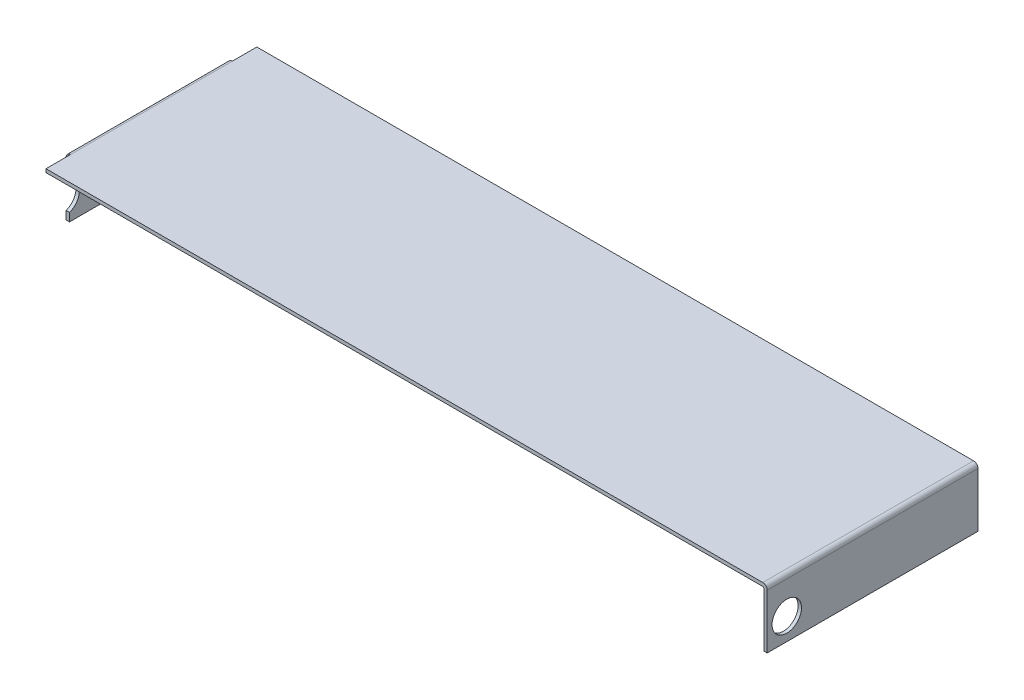
ISO-10303-21;
HEADER;
FILE_DESCRIPTION(('STEP AP214'),'2;1');
FILE_NAME('part.step','',(''),(''),'','','');
FILE_SCHEMA(('AUTOMOTIVE_DESIGN { 1 0 10303 214 1 1 1 1 }'));
ENDSEC;
DATA;
#1=APPLICATION_CONTEXT('core data for automotive mechanical design processes');
#2=APPLICATION_PROTOCOL_DEFINITION('international standard','automotive_design',2000,#1);
#3=PRODUCT_CONTEXT('',#1,'mechanical');
#4=PRODUCT('Part','Part','',(#3));
#5=PRODUCT_RELATED_PRODUCT_CATEGORY('part','',(#4));
#6=PRODUCT_DEFINITION_FORMATION('','',#4);
#7=PRODUCT_DEFINITION_CONTEXT('part definition',#1,'design');
#8=PRODUCT_DEFINITION('design','',#6,#7);
#9=PRODUCT_DEFINITION_SHAPE('','',#8);
#10=(LENGTH_UNIT() NAMED_UNIT(*) SI_UNIT(.MILLI.,.METRE.));
#11=(NAMED_UNIT(*) PLANE_ANGLE_UNIT() SI_UNIT($,.RADIAN.));
#12=(NAMED_UNIT(*) SI_UNIT($,.STERADIAN.) SOLID_ANGLE_UNIT());
#13=UNCERTAINTY_MEASURE_WITH_UNIT(LENGTH_MEASURE(1.E-05),#10,'distance_accuracy_value','');
#14=(GEOMETRIC_REPRESENTATION_CONTEXT(3) GLOBAL_UNCERTAINTY_ASSIGNED_CONTEXT((#13)) GLOBAL_UNIT_ASSIGNED_CONTEXT((#10,
#11,#12)) REPRESENTATION_CONTEXT('',''));
#15=CARTESIAN_POINT('',(0.,0.,0.));
#16=DIRECTION('',(0.,0.,1.));
#17=DIRECTION('',(1.,0.,0.));
#18=AXIS2_PLACEMENT_3D('',#15,#16,#17);
#19=CARTESIAN_POINT('',(-73.1,-12.01,16.));
#20=DIRECTION('',(0.,0.,-1.));
#21=DIRECTION('',(-1.,0.,0.));
#22=AXIS2_PLACEMENT_3D('',#19,#20,#21);
#23=PLANE('',#22);
#24=DIRECTION('',(0.,1.,0.));
#25=VECTOR('',#24,1.);
#26=CARTESIAN_POINT('',(-73.3,2.72643264896885E-13,16.));
#27=LINE('',#26,#25);
#28=CARTESIAN_POINT('',(-73.3,-12.,16.));
#29=VERTEX_POINT('',#28);
#30=CARTESIAN_POINT('',(-73.3,-10.3284271247457,16.));
#31=VERTEX_POINT('',#30);
#32=EDGE_CURVE('E157',#29,#31,#27,.T.);
#33=ORIENTED_EDGE('',*,*,#32,.T.);
#34=DIRECTION('',(-1.,0.,0.));
#35=VECTOR('',#34,1.);
#36=CARTESIAN_POINT('',(-64.,-10.3284271247457,16.));
#37=LINE('',#36,#35);
#38=CARTESIAN_POINT('',(-74.,-10.3284271247457,16.));
#39=VERTEX_POINT('',#38);
#40=EDGE_CURVE('E52',#39,#31,#37,.F.);
#41=ORIENTED_EDGE('',*,*,#40,.F.);
#42=DIRECTION('',(0.,1.,0.));
#43=VECTOR('',#42,1.);
#44=CARTESIAN_POINT('',(-74.,2.75087301834076E-13,16.));
#45=LINE('',#44,#43);
#46=CARTESIAN_POINT('',(-74.,-12.,16.));
#47=VERTEX_POINT('',#46);
#48=EDGE_CURVE('E316',#47,#39,#45,.T.);
#49=ORIENTED_EDGE('',*,*,#48,.F.);
#50=DIRECTION('',(-1.,0.,0.));
#51=VECTOR('',#50,1.);
#52=CARTESIAN_POINT('',(-73.9999999999999,-12.,16.));
#53=LINE('',#52,#51);
#54=EDGE_CURVE('E172',#29,#47,#53,.T.);
#55=ORIENTED_EDGE('',*,*,#54,.F.);
#56=EDGE_LOOP('',(#33,#41,#49,#55));
#57=FACE_BOUND('',#56,.T.);
#58=ADVANCED_FACE('F35',(#57),#23,.F.);
#59=CARTESIAN_POINT('',(-73.1,-12.01,21.));
#60=DIRECTION('',(0.,0.,-1.));
#61=DIRECTION('',(-1.,0.,0.));
#62=AXIS2_PLACEMENT_3D('',#59,#60,#61);
#63=PLANE('',#62);
#64=CARTESIAN_POINT('',(73.1,-0.900000000000012,21.));
#65=DIRECTION('',(0.,0.,-1.));
#66=DIRECTION('',(-1.,0.,0.));
#67=AXIS2_PLACEMENT_3D('',#64,#65,#66);
#68=CIRCLE('',#67,0.899999999999992);
#69=CARTESIAN_POINT('',(74.,-0.90000000000001,21.));
#70=VERTEX_POINT('',#69);
#71=CARTESIAN_POINT('',(73.1,0.,21.));
#72=VERTEX_POINT('',#71);
#73=EDGE_CURVE('E245',#70,#72,#68,.F.);
#74=ORIENTED_EDGE('',*,*,#73,.T.);
#75=DIRECTION('',(-1.,0.,0.));
#76=VECTOR('',#75,1.);
#77=CARTESIAN_POINT('',(0.,0.,21.));
#78=LINE('',#77,#76);
#79=CARTESIAN_POINT('',(-73.1,0.,21.));
#80=VERTEX_POINT('',#79);
#81=EDGE_CURVE('E243',#72,#80,#78,.T.);
#82=ORIENTED_EDGE('',*,*,#81,.T.);
#83=DIRECTION('',(0.,1.,0.));
#84=VECTOR('',#83,1.);
#85=CARTESIAN_POINT('',(-73.1,-12.01,21.));
#86=LINE('',#85,#84);
#87=CARTESIAN_POINT('',(-73.1,-0.700000000000007,21.));
#88=VERTEX_POINT('',#87);
#89=EDGE_CURVE('E186',#88,#80,#86,.T.);
#90=ORIENTED_EDGE('',*,*,#89,.F.);
#91=DIRECTION('',(-1.,0.,0.));
#92=VECTOR('',#91,1.);
#93=CARTESIAN_POINT('',(0.,-0.7,21.));
#94=LINE('',#93,#92);
#95=CARTESIAN_POINT('',(73.1,-0.700000000000021,21.));
#96=VERTEX_POINT('',#95);
#97=EDGE_CURVE('E242',#96,#88,#94,.T.);
#98=ORIENTED_EDGE('',*,*,#97,.F.);
#99=CARTESIAN_POINT('',(73.1,-0.900000000000012,21.));
#100=DIRECTION('',(0.,0.,-1.));
#101=DIRECTION('',(-1.,0.,0.));
#102=AXIS2_PLACEMENT_3D('',#99,#100,#101);
#103=CIRCLE('',#102,0.199999999999992);
#104=CARTESIAN_POINT('',(73.3,-0.900000000000012,21.));
#105=VERTEX_POINT('',#104);
#106=EDGE_CURVE('E306',#105,#96,#103,.F.);
#107=ORIENTED_EDGE('',*,*,#106,.F.);
#108=DIRECTION('',(0.,-1.,0.));
#109=VECTOR('',#108,1.);
#110=CARTESIAN_POINT('',(73.3,1.81762176597924E-13,21.));
#111=LINE('',#110,#109);
#112=CARTESIAN_POINT('',(73.3,-12.,21.));
#113=VERTEX_POINT('',#112);
#114=EDGE_CURVE('E254',#105,#113,#111,.T.);
#115=ORIENTED_EDGE('',*,*,#114,.T.);
#116=DIRECTION('',(-1.,0.,0.));
#117=VECTOR('',#116,1.);
#118=CARTESIAN_POINT('',(74.,-12.,21.));
#119=LINE('',#118,#117);
#120=CARTESIAN_POINT('',(74.,-12.,21.));
#121=VERTEX_POINT('',#120);
#122=EDGE_CURVE('E297',#121,#113,#119,.T.);
#123=ORIENTED_EDGE('',*,*,#122,.F.);
#124=DIRECTION('',(0.,-1.,0.));
#125=VECTOR('',#124,1.);
#126=CARTESIAN_POINT('',(74.,1.84206213535114E-13,21.));
#127=LINE('',#126,#125);
#128=EDGE_CURVE('E302',#70,#121,#127,.T.);
#129=ORIENTED_EDGE('',*,*,#128,.F.);
#130=EDGE_LOOP('',(#74,#82,#90,#98,#107,#115,#123,#129));
#131=FACE_BOUND('',#130,.T.);
#132=ADVANCED_FACE('F334',(#131),#63,.F.);
#133=CARTESIAN_POINT('',(-73.1,-12.01,21.));
#134=DIRECTION('',(1.,0.,0.));
#135=DIRECTION('',(0.,0.,-1.));
#136=AXIS2_PLACEMENT_3D('',#133,#134,#135);
#137=PLANE('',#136);
#138=ORIENTED_EDGE('',*,*,#89,.T.);
#139=DIRECTION('',(0.,0.,-1.));
#140=VECTOR('',#139,1.);
#141=CARTESIAN_POINT('',(-73.1,0.,-45.));
#142=LINE('',#141,#140);
#143=CARTESIAN_POINT('',(-73.1,0.,16.));
#144=VERTEX_POINT('',#143);
#145=EDGE_CURVE('E216',#144,#80,#142,.F.);
#146=ORIENTED_EDGE('',*,*,#145,.F.);
#147=DIRECTION('',(0.,1.,0.));
#148=VECTOR('',#147,1.);
#149=CARTESIAN_POINT('',(-73.1,-12.01,16.));
#150=LINE('',#149,#148);
#151=CARTESIAN_POINT('',(-73.1,-0.700000000000007,16.));
#152=VERTEX_POINT('',#151);
#153=EDGE_CURVE('E39',#152,#144,#150,.T.);
#154=ORIENTED_EDGE('',*,*,#153,.F.);
#155=DIRECTION('',(0.,0.,-1.));
#156=VECTOR('',#155,1.);
#157=CARTESIAN_POINT('',(-73.1,-0.700000000000007,-45.));
#158=LINE('',#157,#156);
#159=EDGE_CURVE('E182',#152,#88,#158,.F.);
#160=ORIENTED_EDGE('',*,*,#159,.T.);
#161=EDGE_LOOP('',(#138,#146,#154,#160));
#162=FACE_BOUND('',#161,.T.);
#163=ADVANCED_FACE('F332',(#162),#137,.F.);
#164=CARTESIAN_POINT('',(-73.1,-0.900000000000013,16.));
#165=DIRECTION('',(0.,0.,-1.));
#166=DIRECTION('',(-1.,0.,0.));
#167=AXIS2_PLACEMENT_3D('',#164,#165,#166);
#168=CIRCLE('',#167,0.900000000000006);
#169=CARTESIAN_POINT('',(-74.,-0.900000000000009,16.));
#170=VERTEX_POINT('',#169);
#171=EDGE_CURVE('E199',#144,#170,#168,.F.);
#172=ORIENTED_EDGE('',*,*,#171,.T.);
#173=CARTESIAN_POINT('',(-74.,-4.67157287525326,16.));
#174=VERTEX_POINT('',#173);
#175=EDGE_CURVE('E173',#174,#170,#45,.T.);
#176=ORIENTED_EDGE('',*,*,#175,.F.);
#177=DIRECTION('',(-1.,0.,0.));
#178=VECTOR('',#177,1.);
#179=CARTESIAN_POINT('',(-64.,-4.6715728752533,16.));
#180=LINE('',#179,#178);
#181=CARTESIAN_POINT('',(-73.3,-4.67157287525326,16.));
#182=VERTEX_POINT('',#181);
#183=EDGE_CURVE('E238',#182,#174,#180,.T.);
#184=ORIENTED_EDGE('',*,*,#183,.F.);
#185=CARTESIAN_POINT('',(-73.3,-0.900000000000012,16.));
#186=VERTEX_POINT('',#185);
#187=EDGE_CURVE('E60',#182,#186,#27,.T.);
#188=ORIENTED_EDGE('',*,*,#187,.T.);
#189=CARTESIAN_POINT('',(-73.1,-0.900000000000013,16.));
#190=DIRECTION('',(0.,0.,-1.));
#191=DIRECTION('',(-1.,0.,0.));
#192=AXIS2_PLACEMENT_3D('',#189,#190,#191);
#193=CIRCLE('',#192,0.200000000000006);
#194=EDGE_CURVE('E201',#152,#186,#193,.F.);
#195=ORIENTED_EDGE('',*,*,#194,.F.);
#196=ORIENTED_EDGE('',*,*,#153,.T.);
#197=EDGE_LOOP('',(#172,#176,#184,#188,#195,#196));
#198=FACE_BOUND('',#197,.T.);
#199=ADVANCED_FACE('F197',(#198),#23,.F.);
#200=CARTESIAN_POINT('',(-73.1,-12.01,-17.));
#201=DIRECTION('',(0.,0.,-1.));
#202=DIRECTION('',(-1.,0.,0.));
#203=AXIS2_PLACEMENT_3D('',#200,#201,#202);
#204=PLANE('',#203);
#205=CARTESIAN_POINT('',(-73.1,-0.900000000000013,-17.));
#206=DIRECTION('',(0.,0.,-1.));
#207=DIRECTION('',(-1.,0.,0.));
#208=AXIS2_PLACEMENT_3D('',#205,#206,#207);
#209=CIRCLE('',#208,0.900000000000006);
#210=CARTESIAN_POINT('',(-73.1,0.,-17.));
#211=VERTEX_POINT('',#210);
#212=CARTESIAN_POINT('',(-74.,-0.900000000000009,-17.));
#213=VERTEX_POINT('',#212);
#214=EDGE_CURVE('E304',#211,#213,#209,.F.);
#215=ORIENTED_EDGE('',*,*,#214,.F.);
#216=DIRECTION('',(0.,1.,0.));
#217=VECTOR('',#216,1.);
#218=CARTESIAN_POINT('',(-73.1,-12.01,-17.));
#219=LINE('',#218,#217);
#220=CARTESIAN_POINT('',(-73.1,-0.700000000000007,-17.));
#221=VERTEX_POINT('',#220);
#222=EDGE_CURVE('E11',#221,#211,#219,.T.);
#223=ORIENTED_EDGE('',*,*,#222,.F.);
#224=CARTESIAN_POINT('',(-73.1,-0.900000000000013,-17.));
#225=DIRECTION('',(0.,0.,-1.));
#226=DIRECTION('',(-1.,0.,0.));
#227=AXIS2_PLACEMENT_3D('',#224,#225,#226);
#228=CIRCLE('',#227,0.200000000000006);
#229=CARTESIAN_POINT('',(-73.3,-0.900000000000012,-17.));
#230=VERTEX_POINT('',#229);
#231=EDGE_CURVE('E170',#221,#230,#228,.F.);
#232=ORIENTED_EDGE('',*,*,#231,.T.);
#233=DIRECTION('',(0.,1.,0.));
#234=VECTOR('',#233,1.);
#235=CARTESIAN_POINT('',(-73.3,2.72643264896886E-13,-17.));
#236=LINE('',#235,#234);
#237=CARTESIAN_POINT('',(-73.3,-12.,-17.));
#238=VERTEX_POINT('',#237);
#239=EDGE_CURVE('E155',#238,#230,#236,.T.);
#240=ORIENTED_EDGE('',*,*,#239,.F.);
#241=DIRECTION('',(-1.,0.,0.));
#242=VECTOR('',#241,1.);
#243=CARTESIAN_POINT('',(-74.,-12.,-17.));
#244=LINE('',#243,#242);
#245=CARTESIAN_POINT('',(-74.,-12.,-17.));
#246=VERTEX_POINT('',#245);
#247=EDGE_CURVE('E168',#238,#246,#244,.T.);
#248=ORIENTED_EDGE('',*,*,#247,.T.);
#249=DIRECTION('',(0.,1.,0.));
#250=VECTOR('',#249,1.);
#251=CARTESIAN_POINT('',(-74.,2.75087301834076E-13,-17.));
#252=LINE('',#251,#250);
#253=EDGE_CURVE('E259',#246,#213,#252,.T.);
#254=ORIENTED_EDGE('',*,*,#253,.T.);
#255=EDGE_LOOP('',(#215,#223,#232,#240,#248,#254));
#256=FACE_BOUND('',#255,.T.);
#257=ADVANCED_FACE('F166',(#256),#204,.T.);
#258=CARTESIAN_POINT('',(-73.1,-12.01,-22.));
#259=DIRECTION('',(-1.,0.,0.));
#260=DIRECTION('',(0.,0.,1.));
#261=AXIS2_PLACEMENT_3D('',#258,#259,#260);
#262=PLANE('',#261);
#263=DIRECTION('',(0.,1.,0.));
#264=VECTOR('',#263,1.);
#265=CARTESIAN_POINT('',(-73.1,-12.01,-22.));
#266=LINE('',#265,#264);
#267=CARTESIAN_POINT('',(-73.1,-0.700000000000007,-22.));
#268=VERTEX_POINT('',#267);
#269=CARTESIAN_POINT('',(-73.1,0.,-22.));
#270=VERTEX_POINT('',#269);
#271=EDGE_CURVE('E44',#268,#270,#266,.T.);
#272=ORIENTED_EDGE('',*,*,#271,.F.);
#273=EDGE_CURVE('E178',#268,#221,#158,.F.);
#274=ORIENTED_EDGE('',*,*,#273,.T.);
#275=ORIENTED_EDGE('',*,*,#222,.T.);
#276=EDGE_CURVE('E219',#270,#211,#142,.F.);
#277=ORIENTED_EDGE('',*,*,#276,.F.);
#278=EDGE_LOOP('',(#272,#274,#275,#277));
#279=FACE_BOUND('',#278,.T.);
#280=ADVANCED_FACE('F341',(#279),#262,.T.);
#281=CARTESIAN_POINT('',(-73.1,-12.01,-22.));
#282=DIRECTION('',(0.,0.,-1.));
#283=DIRECTION('',(-1.,0.,0.));
#284=AXIS2_PLACEMENT_3D('',#281,#282,#283);
#285=PLANE('',#284);
#286=CARTESIAN_POINT('',(73.1,-0.900000000000012,-22.));
#287=DIRECTION('',(0.,0.,-1.));
#288=DIRECTION('',(-1.,0.,0.));
#289=AXIS2_PLACEMENT_3D('',#286,#287,#288);
#290=CIRCLE('',#289,0.899999999999992);
#291=CARTESIAN_POINT('',(74.,-0.90000000000001,-22.));
#292=VERTEX_POINT('',#291);
#293=CARTESIAN_POINT('',(73.1,0.,-22.));
#294=VERTEX_POINT('',#293);
#295=EDGE_CURVE('E292',#292,#294,#290,.F.);
#296=ORIENTED_EDGE('',*,*,#295,.F.);
#297=DIRECTION('',(0.,-1.,0.));
#298=VECTOR('',#297,1.);
#299=CARTESIAN_POINT('',(74.,1.84206213535114E-13,-22.));
#300=LINE('',#299,#298);
#301=CARTESIAN_POINT('',(74.,-12.,-22.));
#302=VERTEX_POINT('',#301);
#303=EDGE_CURVE('E251',#292,#302,#300,.T.);
#304=ORIENTED_EDGE('',*,*,#303,.T.);
#305=DIRECTION('',(-1.,0.,0.));
#306=VECTOR('',#305,1.);
#307=CARTESIAN_POINT('',(74.,-12.,-22.));
#308=LINE('',#307,#306);
#309=CARTESIAN_POINT('',(73.3,-12.,-22.));
#310=VERTEX_POINT('',#309);
#311=EDGE_CURVE('E209',#302,#310,#308,.T.);
#312=ORIENTED_EDGE('',*,*,#311,.T.);
#313=DIRECTION('',(0.,-1.,0.));
#314=VECTOR('',#313,1.);
#315=CARTESIAN_POINT('',(73.3,1.81762176597924E-13,-22.));
#316=LINE('',#315,#314);
#317=CARTESIAN_POINT('',(73.3,-0.900000000000012,-22.));
#318=VERTEX_POINT('',#317);
#319=EDGE_CURVE('E300',#318,#310,#316,.T.);
#320=ORIENTED_EDGE('',*,*,#319,.F.);
#321=CARTESIAN_POINT('',(73.1,-0.900000000000012,-22.));
#322=DIRECTION('',(0.,0.,-1.));
#323=DIRECTION('',(-1.,0.,0.));
#324=AXIS2_PLACEMENT_3D('',#321,#322,#323);
#325=CIRCLE('',#324,0.199999999999992);
#326=CARTESIAN_POINT('',(73.1,-0.700000000000021,-22.));
#327=VERTEX_POINT('',#326);
#328=EDGE_CURVE('E248',#318,#327,#325,.F.);
#329=ORIENTED_EDGE('',*,*,#328,.T.);
#330=DIRECTION('',(-1.,0.,0.));
#331=VECTOR('',#330,1.);
#332=CARTESIAN_POINT('',(0.,-0.7,-22.));
#333=LINE('',#332,#331);
#334=EDGE_CURVE('E239',#327,#268,#333,.T.);
#335=ORIENTED_EDGE('',*,*,#334,.T.);
#336=ORIENTED_EDGE('',*,*,#271,.T.);
#337=DIRECTION('',(-1.,0.,0.));
#338=VECTOR('',#337,1.);
#339=CARTESIAN_POINT('',(0.,0.,-22.));
#340=LINE('',#339,#338);
#341=EDGE_CURVE('E311',#294,#270,#340,.T.);
#342=ORIENTED_EDGE('',*,*,#341,.F.);
#343=EDGE_LOOP('',(#296,#304,#312,#320,#329,#335,#336,#342));
#344=FACE_BOUND('',#343,.T.);
#345=ADVANCED_FACE('F290',(#344),#285,.T.);
#346=CARTESIAN_POINT('',(73.1,-0.900000000000012,45.));
#347=DIRECTION('',(0.,0.,1.));
#348=DIRECTION('',(1.,0.,0.));
#349=AXIS2_PLACEMENT_3D('',#346,#347,#348);
#350=CYLINDRICAL_SURFACE('',#349,0.899999999999992);
#351=DIRECTION('',(0.,0.,1.));
#352=VECTOR('',#351,1.);
#353=CARTESIAN_POINT('',(74.,-0.90000000000001,-45.));
#354=LINE('',#353,#352);
#355=EDGE_CURVE('E226',#70,#292,#354,.F.);
#356=ORIENTED_EDGE('',*,*,#355,.T.);
#357=ORIENTED_EDGE('',*,*,#295,.T.);
#358=DIRECTION('',(0.,0.,1.));
#359=VECTOR('',#358,1.);
#360=CARTESIAN_POINT('',(73.1,0.,45.));
#361=LINE('',#360,#359);
#362=EDGE_CURVE('E236',#72,#294,#361,.F.);
#363=ORIENTED_EDGE('',*,*,#362,.F.);
#364=ORIENTED_EDGE('',*,*,#73,.F.);
#365=EDGE_LOOP('',(#356,#357,#363,#364));
#366=FACE_BOUND('',#365,.T.);
#367=ADVANCED_FACE('F339',(#366),#350,.T.);
#368=CARTESIAN_POINT('',(0.,0.,0.));
#369=DIRECTION('',(0.,1.,0.));
#370=DIRECTION('',(0.,0.,1.));
#371=AXIS2_PLACEMENT_3D('',#368,#369,#370);
#372=PLANE('',#371);
#373=ORIENTED_EDGE('',*,*,#362,.T.);
#374=ORIENTED_EDGE('',*,*,#341,.T.);
#375=ORIENTED_EDGE('',*,*,#276,.T.);
#376=EDGE_CURVE('E208',#211,#144,#142,.F.);
#377=ORIENTED_EDGE('',*,*,#376,.T.);
#378=ORIENTED_EDGE('',*,*,#145,.T.);
#379=ORIENTED_EDGE('',*,*,#81,.F.);
#380=EDGE_LOOP('',(#373,#374,#375,#377,#378,#379));
#381=FACE_BOUND('',#380,.T.);
#382=ADVANCED_FACE('F215',(#381),#372,.T.);
#383=CARTESIAN_POINT('',(73.1,-0.900000000000012,45.));
#384=DIRECTION('',(0.,0.,1.));
#385=DIRECTION('',(1.,0.,0.));
#386=AXIS2_PLACEMENT_3D('',#383,#384,#385);
#387=CYLINDRICAL_SURFACE('',#386,0.199999999999992);
#388=ORIENTED_EDGE('',*,*,#328,.F.);
#389=DIRECTION('',(0.,0.,1.));
#390=VECTOR('',#389,1.);
#391=CARTESIAN_POINT('',(73.3,-0.900000000000012,-45.));
#392=LINE('',#391,#390);
#393=EDGE_CURVE('E221',#318,#105,#392,.T.);
#394=ORIENTED_EDGE('',*,*,#393,.T.);
#395=ORIENTED_EDGE('',*,*,#106,.T.);
#396=DIRECTION('',(0.,0.,1.));
#397=VECTOR('',#396,1.);
#398=CARTESIAN_POINT('',(73.1,-0.700000000000021,45.));
#399=LINE('',#398,#397);
#400=EDGE_CURVE('E234',#96,#327,#399,.F.);
#401=ORIENTED_EDGE('',*,*,#400,.T.);
#402=EDGE_LOOP('',(#388,#394,#395,#401));
#403=FACE_BOUND('',#402,.T.);
#404=ADVANCED_FACE('F458',(#403),#387,.F.);
#405=CARTESIAN_POINT('',(0.,-0.7,0.));
#406=DIRECTION('',(0.,1.,0.));
#407=DIRECTION('',(0.,0.,1.));
#408=AXIS2_PLACEMENT_3D('',#405,#406,#407);
#409=PLANE('',#408);
#410=ORIENTED_EDGE('',*,*,#334,.F.);
#411=ORIENTED_EDGE('',*,*,#400,.F.);
#412=ORIENTED_EDGE('',*,*,#97,.T.);
#413=ORIENTED_EDGE('',*,*,#159,.F.);
#414=EDGE_CURVE('E184',#221,#152,#158,.F.);
#415=ORIENTED_EDGE('',*,*,#414,.F.);
#416=ORIENTED_EDGE('',*,*,#273,.F.);
#417=EDGE_LOOP('',(#410,#411,#412,#413,#415,#416));
#418=FACE_BOUND('',#417,.T.);
#419=ADVANCED_FACE('F329',(#418),#409,.F.);
#420=CARTESIAN_POINT('',(-73.1,-0.900000000000013,-45.));
#421=DIRECTION('',(0.,0.,-1.));
#422=DIRECTION('',(-1.,0.,0.));
#423=AXIS2_PLACEMENT_3D('',#420,#421,#422);
#424=CYLINDRICAL_SURFACE('',#423,0.900000000000006);
#425=ORIENTED_EDGE('',*,*,#376,.F.);
#426=ORIENTED_EDGE('',*,*,#214,.T.);
#427=DIRECTION('',(0.,0.,-1.));
#428=VECTOR('',#427,1.);
#429=CARTESIAN_POINT('',(-74.,-0.900000000000009,45.));
#430=LINE('',#429,#428);
#431=EDGE_CURVE('E160',#213,#170,#430,.F.);
#432=ORIENTED_EDGE('',*,*,#431,.T.);
#433=ORIENTED_EDGE('',*,*,#171,.F.);
#434=EDGE_LOOP('',(#425,#426,#432,#433));
#435=FACE_BOUND('',#434,.T.);
#436=ADVANCED_FACE('F206',(#435),#424,.T.);
#437=CARTESIAN_POINT('',(-73.1,-0.900000000000013,-45.));
#438=DIRECTION('',(0.,0.,-1.));
#439=DIRECTION('',(-1.,0.,0.));
#440=AXIS2_PLACEMENT_3D('',#437,#438,#439);
#441=CYLINDRICAL_SURFACE('',#440,0.200000000000006);
#442=ORIENTED_EDGE('',*,*,#231,.F.);
#443=ORIENTED_EDGE('',*,*,#414,.T.);
#444=ORIENTED_EDGE('',*,*,#194,.T.);
#445=DIRECTION('',(0.,0.,-1.));
#446=VECTOR('',#445,1.);
#447=CARTESIAN_POINT('',(-73.3,-0.900000000000012,45.));
#448=LINE('',#447,#446);
#449=EDGE_CURVE('E264',#186,#230,#448,.T.);
#450=ORIENTED_EDGE('',*,*,#449,.T.);
#451=EDGE_LOOP('',(#442,#443,#444,#450));
#452=FACE_BOUND('',#451,.T.);
#453=ADVANCED_FACE('F325',(#452),#441,.F.);
#454=CARTESIAN_POINT('',(-73.3,2.72643264896886E-13,0.));
#455=DIRECTION('',(1.,0.,0.));
#456=DIRECTION('',(0.,1.,0.));
#457=AXIS2_PLACEMENT_3D('',#454,#455,#456);
#458=PLANE('',#457);
#459=DIRECTION('',(0.,0.,-1.));
#460=VECTOR('',#459,1.);
#461=CARTESIAN_POINT('',(-73.3,-12.,45.));
#462=LINE('',#461,#460);
#463=EDGE_CURVE('E152',#238,#29,#462,.F.);
#464=ORIENTED_EDGE('',*,*,#463,.F.);
#465=ORIENTED_EDGE('',*,*,#239,.T.);
#466=ORIENTED_EDGE('',*,*,#449,.F.);
#467=ORIENTED_EDGE('',*,*,#187,.F.);
#468=CARTESIAN_POINT('',(-73.3,-7.49999999999946,17.));
#469=DIRECTION('',(1.,0.,0.));
#470=DIRECTION('',(0.,1.,0.));
#471=AXIS2_PLACEMENT_3D('',#468,#469,#470);
#472=CIRCLE('',#471,3.);
#473=EDGE_CURVE('E262',#31,#182,#472,.T.);
#474=ORIENTED_EDGE('',*,*,#473,.F.);
#475=ORIENTED_EDGE('',*,*,#32,.F.);
#476=EDGE_LOOP('',(#464,#465,#466,#467,#474,#475));
#477=FACE_BOUND('',#476,.T.);
#478=ADVANCED_FACE('F154',(#477),#458,.T.);
#479=CARTESIAN_POINT('',(-74.,2.75087301834076E-13,0.));
#480=DIRECTION('',(1.,0.,0.));
#481=DIRECTION('',(0.,1.,0.));
#482=AXIS2_PLACEMENT_3D('',#479,#480,#481);
#483=PLANE('',#482);
#484=ORIENTED_EDGE('',*,*,#253,.F.);
#485=DIRECTION('',(0.,0.,1.));
#486=VECTOR('',#485,1.);
#487=CARTESIAN_POINT('',(-74.,-12.,0.));
#488=LINE('',#487,#486);
#489=EDGE_CURVE('E161',#246,#47,#488,.T.);
#490=ORIENTED_EDGE('',*,*,#489,.T.);
#491=ORIENTED_EDGE('',*,*,#48,.T.);
#492=CARTESIAN_POINT('',(-74.,-7.49999999999946,17.));
#493=DIRECTION('',(-1.,0.,0.));
#494=DIRECTION('',(0.,-1.,0.));
#495=AXIS2_PLACEMENT_3D('',#492,#493,#494);
#496=CIRCLE('',#495,3.);
#497=EDGE_CURVE('E263',#174,#39,#496,.T.);
#498=ORIENTED_EDGE('',*,*,#497,.F.);
#499=ORIENTED_EDGE('',*,*,#175,.T.);
#500=ORIENTED_EDGE('',*,*,#431,.F.);
#501=EDGE_LOOP('',(#484,#490,#491,#498,#499,#500));
#502=FACE_BOUND('',#501,.T.);
#503=ADVANCED_FACE('F322',(#502),#483,.F.);
#504=CARTESIAN_POINT('',(-64.,-7.49999999999949,17.));
#505=DIRECTION('',(-1.,0.,0.));
#506=DIRECTION('',(0.,-1.,0.));
#507=AXIS2_PLACEMENT_3D('',#504,#505,#506);
#508=CYLINDRICAL_SURFACE('',#507,3.);
#509=ORIENTED_EDGE('',*,*,#497,.T.);
#510=ORIENTED_EDGE('',*,*,#40,.T.);
#511=ORIENTED_EDGE('',*,*,#473,.T.);
#512=ORIENTED_EDGE('',*,*,#183,.T.);
#513=EDGE_LOOP('',(#509,#510,#511,#512));
#514=FACE_BOUND('',#513,.T.);
#515=ADVANCED_FACE('F319',(#514),#508,.F.);
#516=CARTESIAN_POINT('',(-74.,-12.,45.));
#517=DIRECTION('',(0.,1.,0.));
#518=DIRECTION('',(-1.,0.,0.));
#519=AXIS2_PLACEMENT_3D('',#516,#517,#518);
#520=PLANE('',#519);
#521=ORIENTED_EDGE('',*,*,#247,.F.);
#522=ORIENTED_EDGE('',*,*,#463,.T.);
#523=ORIENTED_EDGE('',*,*,#54,.T.);
#524=ORIENTED_EDGE('',*,*,#489,.F.);
#525=EDGE_LOOP('',(#521,#522,#523,#524));
#526=FACE_BOUND('',#525,.T.);
#527=ADVANCED_FACE('F175',(#526),#520,.F.);
#528=CARTESIAN_POINT('',(74.,-7.5,17.));
#529=DIRECTION('',(-1.,0.,0.));
#530=DIRECTION('',(0.,-1.,0.));
#531=AXIS2_PLACEMENT_3D('',#528,#529,#530);
#532=CYLINDRICAL_SURFACE('',#531,3.);
#533=CARTESIAN_POINT('',(74.,-7.5,17.));
#534=DIRECTION('',(-1.,0.,0.));
#535=DIRECTION('',(0.,-1.,0.));
#536=AXIS2_PLACEMENT_3D('',#533,#534,#535);
#537=CIRCLE('',#536,3.);
#538=CARTESIAN_POINT('',(74.,-10.5,17.));
#539=VERTEX_POINT('',#538);
#540=EDGE_CURVE('E231',#539,#539,#537,.F.);
#541=ORIENTED_EDGE('',*,*,#540,.T.);
#542=EDGE_LOOP('',(#541));
#543=FACE_BOUND('',#542,.T.);
#544=CARTESIAN_POINT('',(73.3,-7.5,17.));
#545=DIRECTION('',(-1.,0.,0.));
#546=DIRECTION('',(0.,-1.,0.));
#547=AXIS2_PLACEMENT_3D('',#544,#545,#546);
#548=CIRCLE('',#547,3.);
#549=CARTESIAN_POINT('',(73.3,-10.5,17.));
#550=VERTEX_POINT('',#549);
#551=EDGE_CURVE('E228',#550,#550,#548,.F.);
#552=ORIENTED_EDGE('',*,*,#551,.F.);
#553=EDGE_LOOP('',(#552));
#554=FACE_BOUND('',#553,.T.);
#555=ADVANCED_FACE('F277',(#543,#554),#532,.F.);
#556=CARTESIAN_POINT('',(73.3,1.81762176597924E-13,0.));
#557=DIRECTION('',(-1.,0.,0.));
#558=DIRECTION('',(0.,-1.,0.));
#559=AXIS2_PLACEMENT_3D('',#556,#557,#558);
#560=PLANE('',#559);
#561=ORIENTED_EDGE('',*,*,#551,.T.);
#562=EDGE_LOOP('',(#561));
#563=FACE_BOUND('',#562,.T.);
#564=ORIENTED_EDGE('',*,*,#393,.F.);
#565=ORIENTED_EDGE('',*,*,#319,.T.);
#566=DIRECTION('',(0.,0.,1.));
#567=VECTOR('',#566,1.);
#568=CARTESIAN_POINT('',(73.3,-12.,-45.));
#569=LINE('',#568,#567);
#570=EDGE_CURVE('E229',#113,#310,#569,.F.);
#571=ORIENTED_EDGE('',*,*,#570,.F.);
#572=ORIENTED_EDGE('',*,*,#114,.F.);
#573=EDGE_LOOP('',(#564,#565,#571,#572));
#574=FACE_BOUND('',#573,.T.);
#575=ADVANCED_FACE('F283',(#563,#574),#560,.T.);
#576=CARTESIAN_POINT('',(74.,1.84206213535114E-13,0.));
#577=DIRECTION('',(-1.,0.,0.));
#578=DIRECTION('',(0.,-1.,0.));
#579=AXIS2_PLACEMENT_3D('',#576,#577,#578);
#580=PLANE('',#579);
#581=ORIENTED_EDGE('',*,*,#540,.F.);
#582=EDGE_LOOP('',(#581));
#583=FACE_BOUND('',#582,.T.);
#584=ORIENTED_EDGE('',*,*,#303,.F.);
#585=ORIENTED_EDGE('',*,*,#355,.F.);
#586=ORIENTED_EDGE('',*,*,#128,.T.);
#587=DIRECTION('',(0.,0.,-1.));
#588=VECTOR('',#587,1.);
#589=CARTESIAN_POINT('',(74.,-12.,0.));
#590=LINE('',#589,#588);
#591=EDGE_CURVE('E232',#121,#302,#590,.T.);
#592=ORIENTED_EDGE('',*,*,#591,.T.);
#593=EDGE_LOOP('',(#584,#585,#586,#592));
#594=FACE_BOUND('',#593,.T.);
#595=ADVANCED_FACE('F280',(#583,#594),#580,.F.);
#596=CARTESIAN_POINT('',(74.,-12.,-45.));
#597=DIRECTION('',(0.,1.,0.));
#598=DIRECTION('',(-1.,0.,0.));
#599=AXIS2_PLACEMENT_3D('',#596,#597,#598);
#600=PLANE('',#599);
#601=ORIENTED_EDGE('',*,*,#311,.F.);
#602=ORIENTED_EDGE('',*,*,#591,.F.);
#603=ORIENTED_EDGE('',*,*,#122,.T.);
#604=ORIENTED_EDGE('',*,*,#570,.T.);
#605=EDGE_LOOP('',(#601,#602,#603,#604));
#606=FACE_BOUND('',#605,.T.);
#607=ADVANCED_FACE('F37',(#606),#600,.F.);
#608=CLOSED_SHELL('',(#58,#132,#163,#199,#257,#280,#345,#367,#382,#404,#419,#436,#453,#478,#503,
#515,#527,#555,#575,#595,#607));
#609=MANIFOLD_SOLID_BREP('B2',#608);
#610=ADVANCED_BREP_SHAPE_REPRESENTATION('',(#18,#609),#14);
#611=SHAPE_DEFINITION_REPRESENTATION(#9,#610);
ENDSEC;
END-ISO-10303-21;
